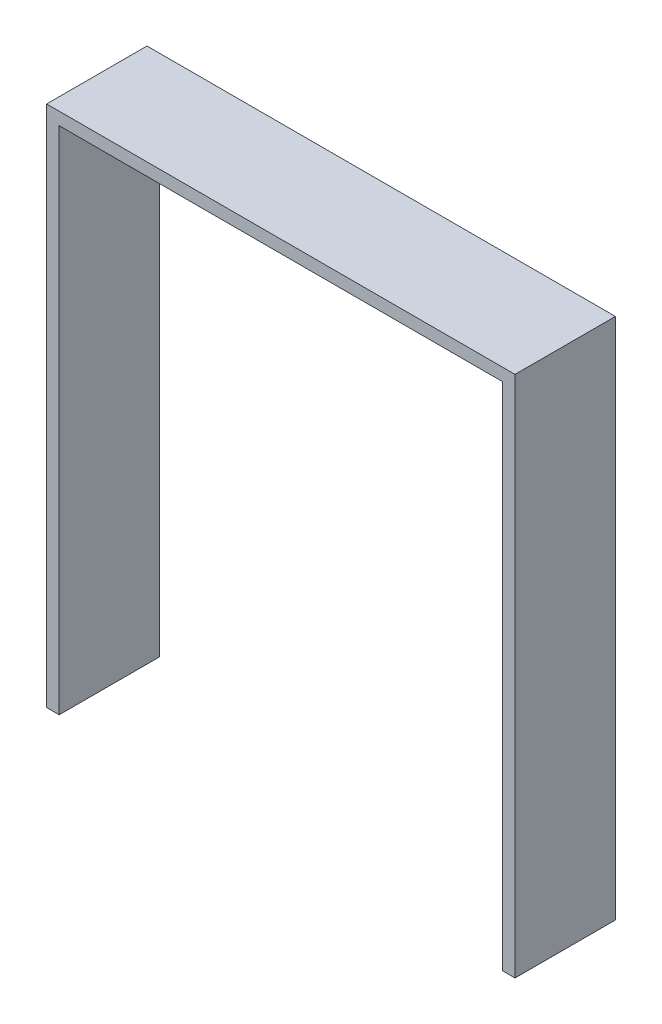
ISO-10303-21;
HEADER;
FILE_DESCRIPTION(('STEP AP214'),'2;1');
FILE_NAME('part.step','',(''),(''),'','','');
FILE_SCHEMA(('AUTOMOTIVE_DESIGN { 1 0 10303 214 1 1 1 1 }'));
ENDSEC;
DATA;
#1=APPLICATION_CONTEXT('core data for automotive mechanical design processes');
#2=APPLICATION_PROTOCOL_DEFINITION('international standard','automotive_design',2000,#1);
#3=PRODUCT_CONTEXT('',#1,'mechanical');
#4=PRODUCT('Part','Part','',(#3));
#5=PRODUCT_RELATED_PRODUCT_CATEGORY('part','',(#4));
#6=PRODUCT_DEFINITION_FORMATION('','',#4);
#7=PRODUCT_DEFINITION_CONTEXT('part definition',#1,'design');
#8=PRODUCT_DEFINITION('design','',#6,#7);
#9=PRODUCT_DEFINITION_SHAPE('','',#8);
#10=(LENGTH_UNIT() NAMED_UNIT(*) SI_UNIT(.MILLI.,.METRE.));
#11=(NAMED_UNIT(*) PLANE_ANGLE_UNIT() SI_UNIT($,.RADIAN.));
#12=(NAMED_UNIT(*) SI_UNIT($,.STERADIAN.) SOLID_ANGLE_UNIT());
#13=UNCERTAINTY_MEASURE_WITH_UNIT(LENGTH_MEASURE(1.E-05),#10,'distance_accuracy_value','');
#14=(GEOMETRIC_REPRESENTATION_CONTEXT(3) GLOBAL_UNCERTAINTY_ASSIGNED_CONTEXT((#13)) GLOBAL_UNIT_ASSIGNED_CONTEXT((#10,
#11,#12)) REPRESENTATION_CONTEXT('',''));
#15=CARTESIAN_POINT('',(0.,0.,0.));
#16=DIRECTION('',(0.,0.,1.));
#17=DIRECTION('',(1.,0.,0.));
#18=AXIS2_PLACEMENT_3D('',#15,#16,#17);
#19=CARTESIAN_POINT('',(0.,0.,24.));
#20=DIRECTION('',(0.,1.,0.));
#21=DIRECTION('',(0.,0.,1.));
#22=AXIS2_PLACEMENT_3D('',#19,#20,#21);
#23=PLANE('',#22);
#24=DIRECTION('',(1.,0.,0.));
#25=VECTOR('',#24,1.);
#26=CARTESIAN_POINT('',(0.,0.,0.));
#27=LINE('',#26,#25);
#28=CARTESIAN_POINT('',(-3.,0.,0.));
#29=VERTEX_POINT('',#28);
#30=CARTESIAN_POINT('',(0.,0.,0.));
#31=VERTEX_POINT('',#30);
#32=EDGE_CURVE('E135',#29,#31,#27,.T.);
#33=ORIENTED_EDGE('',*,*,#32,.T.);
#34=DIRECTION('',(0.,0.,-1.));
#35=VECTOR('',#34,1.);
#36=CARTESIAN_POINT('',(0.,0.,24.));
#37=LINE('',#36,#35);
#38=CARTESIAN_POINT('',(0.,0.,24.));
#39=VERTEX_POINT('',#38);
#40=EDGE_CURVE('E11',#39,#31,#37,.T.);
#41=ORIENTED_EDGE('',*,*,#40,.F.);
#42=DIRECTION('',(1.,0.,0.));
#43=VECTOR('',#42,1.);
#44=CARTESIAN_POINT('',(0.,0.,24.));
#45=LINE('',#44,#43);
#46=CARTESIAN_POINT('',(-3.,0.,24.));
#47=VERTEX_POINT('',#46);
#48=EDGE_CURVE('E149',#47,#39,#45,.T.);
#49=ORIENTED_EDGE('',*,*,#48,.F.);
#50=DIRECTION('',(0.,0.,-1.));
#51=VECTOR('',#50,1.);
#52=CARTESIAN_POINT('',(-3.,0.,24.));
#53=LINE('',#52,#51);
#54=EDGE_CURVE('E131',#47,#29,#53,.T.);
#55=ORIENTED_EDGE('',*,*,#54,.T.);
#56=EDGE_LOOP('',(#33,#41,#49,#55));
#57=FACE_BOUND('',#56,.T.);
#58=ADVANCED_FACE('F39',(#57),#23,.F.);
#59=CARTESIAN_POINT('',(0.,122.,24.));
#60=DIRECTION('',(-1.,0.,0.));
#61=DIRECTION('',(0.,0.,1.));
#62=AXIS2_PLACEMENT_3D('',#59,#60,#61);
#63=PLANE('',#62);
#64=DIRECTION('',(0.,1.,0.));
#65=VECTOR('',#64,1.);
#66=CARTESIAN_POINT('',(0.,122.,0.));
#67=LINE('',#66,#65);
#68=CARTESIAN_POINT('',(0.,122.,0.));
#69=VERTEX_POINT('',#68);
#70=EDGE_CURVE('E138',#31,#69,#67,.T.);
#71=ORIENTED_EDGE('',*,*,#70,.T.);
#72=DIRECTION('',(0.,0.,-1.));
#73=VECTOR('',#72,1.);
#74=CARTESIAN_POINT('',(0.,122.,24.));
#75=LINE('',#74,#73);
#76=CARTESIAN_POINT('',(0.,122.,24.));
#77=VERTEX_POINT('',#76);
#78=EDGE_CURVE('E47',#77,#69,#75,.T.);
#79=ORIENTED_EDGE('',*,*,#78,.F.);
#80=DIRECTION('',(0.,1.,0.));
#81=VECTOR('',#80,1.);
#82=CARTESIAN_POINT('',(0.,122.,24.));
#83=LINE('',#82,#81);
#84=EDGE_CURVE('E98',#39,#77,#83,.T.);
#85=ORIENTED_EDGE('',*,*,#84,.F.);
#86=ORIENTED_EDGE('',*,*,#40,.T.);
#87=EDGE_LOOP('',(#71,#79,#85,#86));
#88=FACE_BOUND('',#87,.T.);
#89=ADVANCED_FACE('F184',(#88),#63,.F.);
#90=CARTESIAN_POINT('',(106.,122.,24.));
#91=DIRECTION('',(0.,1.,0.));
#92=DIRECTION('',(0.,0.,1.));
#93=AXIS2_PLACEMENT_3D('',#90,#91,#92);
#94=PLANE('',#93);
#95=DIRECTION('',(1.,0.,0.));
#96=VECTOR('',#95,1.);
#97=CARTESIAN_POINT('',(106.,122.,0.));
#98=LINE('',#97,#96);
#99=CARTESIAN_POINT('',(106.,122.,0.));
#100=VERTEX_POINT('',#99);
#101=EDGE_CURVE('E140',#69,#100,#98,.T.);
#102=ORIENTED_EDGE('',*,*,#101,.T.);
#103=DIRECTION('',(0.,0.,-1.));
#104=VECTOR('',#103,1.);
#105=CARTESIAN_POINT('',(106.,122.,24.));
#106=LINE('',#105,#104);
#107=CARTESIAN_POINT('',(106.,122.,24.));
#108=VERTEX_POINT('',#107);
#109=EDGE_CURVE('E156',#108,#100,#106,.T.);
#110=ORIENTED_EDGE('',*,*,#109,.F.);
#111=DIRECTION('',(1.,0.,0.));
#112=VECTOR('',#111,1.);
#113=CARTESIAN_POINT('',(106.,122.,24.));
#114=LINE('',#113,#112);
#115=EDGE_CURVE('E164',#77,#108,#114,.T.);
#116=ORIENTED_EDGE('',*,*,#115,.F.);
#117=ORIENTED_EDGE('',*,*,#78,.T.);
#118=EDGE_LOOP('',(#102,#110,#116,#117));
#119=FACE_BOUND('',#118,.T.);
#120=ADVANCED_FACE('F162',(#119),#94,.F.);
#121=CARTESIAN_POINT('',(106.,0.,24.));
#122=DIRECTION('',(1.,0.,0.));
#123=DIRECTION('',(0.,0.,-1.));
#124=AXIS2_PLACEMENT_3D('',#121,#122,#123);
#125=PLANE('',#124);
#126=DIRECTION('',(0.,-1.,0.));
#127=VECTOR('',#126,1.);
#128=CARTESIAN_POINT('',(106.,0.,0.));
#129=LINE('',#128,#127);
#130=CARTESIAN_POINT('',(106.,0.,0.));
#131=VERTEX_POINT('',#130);
#132=EDGE_CURVE('E142',#100,#131,#129,.T.);
#133=ORIENTED_EDGE('',*,*,#132,.T.);
#134=DIRECTION('',(0.,0.,-1.));
#135=VECTOR('',#134,1.);
#136=CARTESIAN_POINT('',(106.,0.,24.));
#137=LINE('',#136,#135);
#138=CARTESIAN_POINT('',(106.,0.,24.));
#139=VERTEX_POINT('',#138);
#140=EDGE_CURVE('E153',#139,#131,#137,.T.);
#141=ORIENTED_EDGE('',*,*,#140,.F.);
#142=DIRECTION('',(0.,-1.,0.));
#143=VECTOR('',#142,1.);
#144=CARTESIAN_POINT('',(106.,0.,24.));
#145=LINE('',#144,#143);
#146=EDGE_CURVE('E176',#108,#139,#145,.T.);
#147=ORIENTED_EDGE('',*,*,#146,.F.);
#148=ORIENTED_EDGE('',*,*,#109,.T.);
#149=EDGE_LOOP('',(#133,#141,#147,#148));
#150=FACE_BOUND('',#149,.T.);
#151=ADVANCED_FACE('F172',(#150),#125,.F.);
#152=CARTESIAN_POINT('',(109.,0.,24.));
#153=DIRECTION('',(0.,1.,0.));
#154=DIRECTION('',(0.,0.,1.));
#155=AXIS2_PLACEMENT_3D('',#152,#153,#154);
#156=PLANE('',#155);
#157=DIRECTION('',(1.,0.,0.));
#158=VECTOR('',#157,1.);
#159=CARTESIAN_POINT('',(109.,0.,0.));
#160=LINE('',#159,#158);
#161=CARTESIAN_POINT('',(109.,0.,0.));
#162=VERTEX_POINT('',#161);
#163=EDGE_CURVE('E144',#131,#162,#160,.T.);
#164=ORIENTED_EDGE('',*,*,#163,.T.);
#165=DIRECTION('',(0.,0.,-1.));
#166=VECTOR('',#165,1.);
#167=CARTESIAN_POINT('',(109.,0.,24.));
#168=LINE('',#167,#166);
#169=CARTESIAN_POINT('',(109.,0.,24.));
#170=VERTEX_POINT('',#169);
#171=EDGE_CURVE('E126',#170,#162,#168,.T.);
#172=ORIENTED_EDGE('',*,*,#171,.F.);
#173=DIRECTION('',(1.,0.,0.));
#174=VECTOR('',#173,1.);
#175=CARTESIAN_POINT('',(109.,0.,24.));
#176=LINE('',#175,#174);
#177=EDGE_CURVE('E117',#139,#170,#176,.T.);
#178=ORIENTED_EDGE('',*,*,#177,.F.);
#179=ORIENTED_EDGE('',*,*,#140,.T.);
#180=EDGE_LOOP('',(#164,#172,#178,#179));
#181=FACE_BOUND('',#180,.T.);
#182=ADVANCED_FACE('F175',(#181),#156,.F.);
#183=CARTESIAN_POINT('',(109.,125.,24.));
#184=DIRECTION('',(-1.,0.,0.));
#185=DIRECTION('',(0.,0.,1.));
#186=AXIS2_PLACEMENT_3D('',#183,#184,#185);
#187=PLANE('',#186);
#188=DIRECTION('',(0.,1.,0.));
#189=VECTOR('',#188,1.);
#190=CARTESIAN_POINT('',(109.,125.,0.));
#191=LINE('',#190,#189);
#192=CARTESIAN_POINT('',(109.,125.,0.));
#193=VERTEX_POINT('',#192);
#194=EDGE_CURVE('E125',#162,#193,#191,.T.);
#195=ORIENTED_EDGE('',*,*,#194,.T.);
#196=DIRECTION('',(0.,0.,-1.));
#197=VECTOR('',#196,1.);
#198=CARTESIAN_POINT('',(109.,125.,24.));
#199=LINE('',#198,#197);
#200=CARTESIAN_POINT('',(109.,125.,24.));
#201=VERTEX_POINT('',#200);
#202=EDGE_CURVE('E122',#201,#193,#199,.T.);
#203=ORIENTED_EDGE('',*,*,#202,.F.);
#204=DIRECTION('',(0.,1.,0.));
#205=VECTOR('',#204,1.);
#206=CARTESIAN_POINT('',(109.,125.,24.));
#207=LINE('',#206,#205);
#208=EDGE_CURVE('E111',#170,#201,#207,.T.);
#209=ORIENTED_EDGE('',*,*,#208,.F.);
#210=ORIENTED_EDGE('',*,*,#171,.T.);
#211=EDGE_LOOP('',(#195,#203,#209,#210));
#212=FACE_BOUND('',#211,.T.);
#213=ADVANCED_FACE('F123',(#212),#187,.F.);
#214=CARTESIAN_POINT('',(-3.,125.,24.));
#215=DIRECTION('',(0.,-1.,0.));
#216=DIRECTION('',(0.,0.,-1.));
#217=AXIS2_PLACEMENT_3D('',#214,#215,#216);
#218=PLANE('',#217);
#219=DIRECTION('',(-1.,0.,0.));
#220=VECTOR('',#219,1.);
#221=CARTESIAN_POINT('',(-3.,125.,0.));
#222=LINE('',#221,#220);
#223=CARTESIAN_POINT('',(-3.,125.,0.));
#224=VERTEX_POINT('',#223);
#225=EDGE_CURVE('E84',#193,#224,#222,.T.);
#226=ORIENTED_EDGE('',*,*,#225,.T.);
#227=DIRECTION('',(0.,0.,-1.));
#228=VECTOR('',#227,1.);
#229=CARTESIAN_POINT('',(-3.,125.,24.));
#230=LINE('',#229,#228);
#231=CARTESIAN_POINT('',(-3.,125.,24.));
#232=VERTEX_POINT('',#231);
#233=EDGE_CURVE('E127',#232,#224,#230,.T.);
#234=ORIENTED_EDGE('',*,*,#233,.F.);
#235=DIRECTION('',(-1.,0.,0.));
#236=VECTOR('',#235,1.);
#237=CARTESIAN_POINT('',(-3.,125.,24.));
#238=LINE('',#237,#236);
#239=EDGE_CURVE('E115',#201,#232,#238,.T.);
#240=ORIENTED_EDGE('',*,*,#239,.F.);
#241=ORIENTED_EDGE('',*,*,#202,.T.);
#242=EDGE_LOOP('',(#226,#234,#240,#241));
#243=FACE_BOUND('',#242,.T.);
#244=ADVANCED_FACE('F129',(#243),#218,.F.);
#245=CARTESIAN_POINT('',(-3.,0.,24.));
#246=DIRECTION('',(1.,0.,0.));
#247=DIRECTION('',(0.,0.,-1.));
#248=AXIS2_PLACEMENT_3D('',#245,#246,#247);
#249=PLANE('',#248);
#250=DIRECTION('',(0.,-1.,0.));
#251=VECTOR('',#250,1.);
#252=CARTESIAN_POINT('',(-3.,0.,0.));
#253=LINE('',#252,#251);
#254=EDGE_CURVE('E90',#224,#29,#253,.T.);
#255=ORIENTED_EDGE('',*,*,#254,.T.);
#256=ORIENTED_EDGE('',*,*,#54,.F.);
#257=DIRECTION('',(0.,-1.,0.));
#258=VECTOR('',#257,1.);
#259=CARTESIAN_POINT('',(-3.,0.,24.));
#260=LINE('',#259,#258);
#261=EDGE_CURVE('E55',#232,#47,#260,.T.);
#262=ORIENTED_EDGE('',*,*,#261,.F.);
#263=ORIENTED_EDGE('',*,*,#233,.T.);
#264=EDGE_LOOP('',(#255,#256,#262,#263));
#265=FACE_BOUND('',#264,.T.);
#266=ADVANCED_FACE('F200',(#265),#249,.F.);
#267=CARTESIAN_POINT('',(0.,0.,24.));
#268=DIRECTION('',(0.,0.,-1.));
#269=DIRECTION('',(-1.,0.,0.));
#270=AXIS2_PLACEMENT_3D('',#267,#268,#269);
#271=PLANE('',#270);
#272=ORIENTED_EDGE('',*,*,#48,.T.);
#273=ORIENTED_EDGE('',*,*,#84,.T.);
#274=ORIENTED_EDGE('',*,*,#115,.T.);
#275=ORIENTED_EDGE('',*,*,#146,.T.);
#276=ORIENTED_EDGE('',*,*,#177,.T.);
#277=ORIENTED_EDGE('',*,*,#208,.T.);
#278=ORIENTED_EDGE('',*,*,#239,.T.);
#279=ORIENTED_EDGE('',*,*,#261,.T.);
#280=EDGE_LOOP('',(#272,#273,#274,#275,#276,#277,#278,#279));
#281=FACE_BOUND('',#280,.T.);
#282=ADVANCED_FACE('F113',(#281),#271,.F.);
#283=CARTESIAN_POINT('',(0.,0.,0.));
#284=DIRECTION('',(0.,0.,-1.));
#285=DIRECTION('',(-1.,0.,0.));
#286=AXIS2_PLACEMENT_3D('',#283,#284,#285);
#287=PLANE('',#286);
#288=ORIENTED_EDGE('',*,*,#32,.F.);
#289=ORIENTED_EDGE('',*,*,#254,.F.);
#290=ORIENTED_EDGE('',*,*,#225,.F.);
#291=ORIENTED_EDGE('',*,*,#194,.F.);
#292=ORIENTED_EDGE('',*,*,#163,.F.);
#293=ORIENTED_EDGE('',*,*,#132,.F.);
#294=ORIENTED_EDGE('',*,*,#101,.F.);
#295=ORIENTED_EDGE('',*,*,#70,.F.);
#296=EDGE_LOOP('',(#288,#289,#290,#291,#292,#293,#294,#295));
#297=FACE_BOUND('',#296,.T.);
#298=ADVANCED_FACE('F168',(#297),#287,.T.);
#299=CLOSED_SHELL('',(#58,#89,#120,#151,#182,#213,#244,#266,#282,#298));
#300=MANIFOLD_SOLID_BREP('B2',#299);
#301=ADVANCED_BREP_SHAPE_REPRESENTATION('',(#18,#300),#14);
#302=SHAPE_DEFINITION_REPRESENTATION(#9,#301);
ENDSEC;
END-ISO-10303-21;
